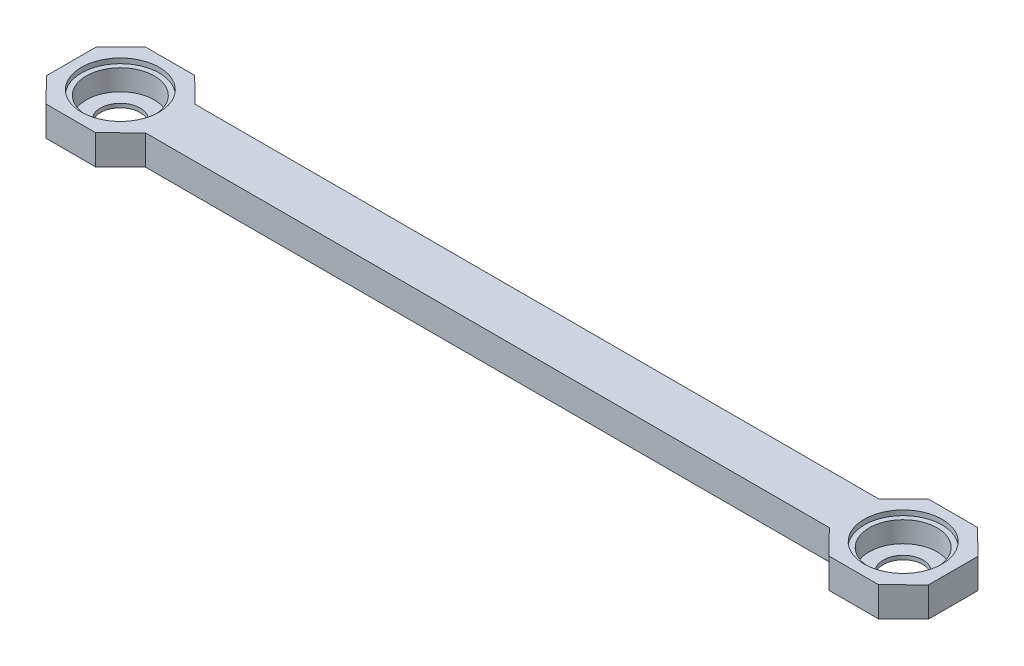
ISO-10303-21;
HEADER;
FILE_DESCRIPTION(('STEP AP214'),'2;1');
FILE_NAME('part.step','',(''),(''),'','','');
FILE_SCHEMA(('AUTOMOTIVE_DESIGN { 1 0 10303 214 1 1 1 1 }'));
ENDSEC;
DATA;
#1=APPLICATION_CONTEXT('core data for automotive mechanical design processes');
#2=APPLICATION_PROTOCOL_DEFINITION('international standard','automotive_design',2000,#1);
#3=PRODUCT_CONTEXT('',#1,'mechanical');
#4=PRODUCT('Part','Part','',(#3));
#5=PRODUCT_RELATED_PRODUCT_CATEGORY('part','',(#4));
#6=PRODUCT_DEFINITION_FORMATION('','',#4);
#7=PRODUCT_DEFINITION_CONTEXT('part definition',#1,'design');
#8=PRODUCT_DEFINITION('design','',#6,#7);
#9=PRODUCT_DEFINITION_SHAPE('','',#8);
#10=(LENGTH_UNIT() NAMED_UNIT(*) SI_UNIT(.MILLI.,.METRE.));
#11=(NAMED_UNIT(*) PLANE_ANGLE_UNIT() SI_UNIT($,.RADIAN.));
#12=(NAMED_UNIT(*) SI_UNIT($,.STERADIAN.) SOLID_ANGLE_UNIT());
#13=UNCERTAINTY_MEASURE_WITH_UNIT(LENGTH_MEASURE(1.E-05),#10,'distance_accuracy_value','');
#14=(GEOMETRIC_REPRESENTATION_CONTEXT(3) GLOBAL_UNCERTAINTY_ASSIGNED_CONTEXT((#13)) GLOBAL_UNIT_ASSIGNED_CONTEXT((#10,
#11,#12)) REPRESENTATION_CONTEXT('',''));
#15=CARTESIAN_POINT('',(0.,0.,0.));
#16=DIRECTION('',(0.,0.,1.));
#17=DIRECTION('',(1.,0.,0.));
#18=AXIS2_PLACEMENT_3D('',#15,#16,#17);
#19=CARTESIAN_POINT('',(82.6366555158427,0.8,0.));
#20=DIRECTION('',(0.,1.,0.));
#21=DIRECTION('',(0.,0.,1.));
#22=AXIS2_PLACEMENT_3D('',#19,#20,#21);
#23=CYLINDRICAL_SURFACE('',#22,6.85000000000001);
#24=CARTESIAN_POINT('',(82.6366555158427,0.8,0.));
#25=DIRECTION('',(0.,1.,0.));
#26=DIRECTION('',(0.,0.,1.));
#27=AXIS2_PLACEMENT_3D('',#24,#25,#26);
#28=CIRCLE('',#27,6.85000000000001);
#29=CARTESIAN_POINT('',(82.6366555158427,0.8,6.85000000000001));
#30=VERTEX_POINT('',#29);
#31=EDGE_CURVE('E252',#30,#30,#28,.T.);
#32=ORIENTED_EDGE('',*,*,#31,.F.);
#33=EDGE_LOOP('',(#32));
#34=FACE_BOUND('',#33,.T.);
#35=CARTESIAN_POINT('',(82.6366555158427,5.,0.));
#36=DIRECTION('',(0.,1.,0.));
#37=DIRECTION('',(0.,0.,1.));
#38=AXIS2_PLACEMENT_3D('',#35,#36,#37);
#39=CIRCLE('',#38,6.85000000000001);
#40=CARTESIAN_POINT('',(82.6366555158427,5.,6.85000000000001));
#41=VERTEX_POINT('',#40);
#42=EDGE_CURVE('E38',#41,#41,#39,.F.);
#43=ORIENTED_EDGE('',*,*,#42,.F.);
#44=EDGE_LOOP('',(#43));
#45=FACE_BOUND('',#44,.T.);
#46=ADVANCED_FACE('F34',(#34,#45),#23,.F.);
#47=CARTESIAN_POINT('',(-75.3633444841573,0.8,0.));
#48=DIRECTION('',(0.,1.,0.));
#49=DIRECTION('',(0.,0.,1.));
#50=AXIS2_PLACEMENT_3D('',#47,#48,#49);
#51=CYLINDRICAL_SURFACE('',#50,6.85);
#52=CARTESIAN_POINT('',(-75.3633444841573,0.8,0.));
#53=DIRECTION('',(0.,1.,0.));
#54=DIRECTION('',(0.,0.,1.));
#55=AXIS2_PLACEMENT_3D('',#52,#53,#54);
#56=CIRCLE('',#55,6.85);
#57=CARTESIAN_POINT('',(-75.3633444841573,0.8,6.85));
#58=VERTEX_POINT('',#57);
#59=EDGE_CURVE('E261',#58,#58,#56,.T.);
#60=ORIENTED_EDGE('',*,*,#59,.F.);
#61=EDGE_LOOP('',(#60));
#62=FACE_BOUND('',#61,.T.);
#63=CARTESIAN_POINT('',(-75.3633444841573,5.,0.));
#64=DIRECTION('',(0.,1.,0.));
#65=DIRECTION('',(0.,0.,1.));
#66=AXIS2_PLACEMENT_3D('',#63,#64,#65);
#67=CIRCLE('',#66,6.85);
#68=CARTESIAN_POINT('',(-75.3633444841573,5.,6.85));
#69=VERTEX_POINT('',#68);
#70=EDGE_CURVE('E255',#69,#69,#67,.F.);
#71=ORIENTED_EDGE('',*,*,#70,.F.);
#72=EDGE_LOOP('',(#71));
#73=FACE_BOUND('',#72,.T.);
#74=ADVANCED_FACE('F337',(#62,#73),#51,.F.);
#75=CARTESIAN_POINT('',(-75.3633444841573,6.,0.));
#76=DIRECTION('',(0.,-1.,0.));
#77=DIRECTION('',(0.,0.,-1.));
#78=AXIS2_PLACEMENT_3D('',#75,#76,#77);
#79=CYLINDRICAL_SURFACE('',#78,4.00000000000001);
#80=CARTESIAN_POINT('',(-75.3633444841573,0.,0.));
#81=DIRECTION('',(0.,1.,0.));
#82=DIRECTION('',(0.,0.,1.));
#83=AXIS2_PLACEMENT_3D('',#80,#81,#82);
#84=CIRCLE('',#83,4.00000000000001);
#85=CARTESIAN_POINT('',(-75.3633444841573,0.,4.00000000000001));
#86=VERTEX_POINT('',#85);
#87=EDGE_CURVE('E185',#86,#86,#84,.T.);
#88=ORIENTED_EDGE('',*,*,#87,.F.);
#89=EDGE_LOOP('',(#88));
#90=FACE_BOUND('',#89,.T.);
#91=CARTESIAN_POINT('',(-75.3633444841573,0.8,0.));
#92=DIRECTION('',(0.,1.,0.));
#93=DIRECTION('',(0.,0.,1.));
#94=AXIS2_PLACEMENT_3D('',#91,#92,#93);
#95=CIRCLE('',#94,4.00000000000001);
#96=CARTESIAN_POINT('',(-75.3633444841573,0.8,4.00000000000001));
#97=VERTEX_POINT('',#96);
#98=EDGE_CURVE('E251',#97,#97,#95,.T.);
#99=ORIENTED_EDGE('',*,*,#98,.T.);
#100=EDGE_LOOP('',(#99));
#101=FACE_BOUND('',#100,.T.);
#102=ADVANCED_FACE('F343',(#90,#101),#79,.F.);
#103=CARTESIAN_POINT('',(82.6366555158427,6.,0.));
#104=DIRECTION('',(0.,-1.,0.));
#105=DIRECTION('',(0.,0.,-1.));
#106=AXIS2_PLACEMENT_3D('',#103,#104,#105);
#107=CYLINDRICAL_SURFACE('',#106,4.00000000000001);
#108=CARTESIAN_POINT('',(82.6366555158427,0.,0.));
#109=DIRECTION('',(0.,1.,0.));
#110=DIRECTION('',(0.,0.,1.));
#111=AXIS2_PLACEMENT_3D('',#108,#109,#110);
#112=CIRCLE('',#111,4.00000000000001);
#113=CARTESIAN_POINT('',(82.6366555158427,0.,4.00000000000001));
#114=VERTEX_POINT('',#113);
#115=EDGE_CURVE('E254',#114,#114,#112,.T.);
#116=ORIENTED_EDGE('',*,*,#115,.F.);
#117=EDGE_LOOP('',(#116));
#118=FACE_BOUND('',#117,.T.);
#119=CARTESIAN_POINT('',(82.6366555158427,0.8,0.));
#120=DIRECTION('',(0.,1.,0.));
#121=DIRECTION('',(0.,0.,1.));
#122=AXIS2_PLACEMENT_3D('',#119,#120,#121);
#123=CIRCLE('',#122,4.00000000000001);
#124=CARTESIAN_POINT('',(82.6366555158427,0.8,4.00000000000001));
#125=VERTEX_POINT('',#124);
#126=EDGE_CURVE('E248',#125,#125,#123,.T.);
#127=ORIENTED_EDGE('',*,*,#126,.T.);
#128=EDGE_LOOP('',(#127));
#129=FACE_BOUND('',#128,.T.);
#130=ADVANCED_FACE('F354',(#118,#129),#107,.F.);
#131=CARTESIAN_POINT('',(0.,6.,0.));
#132=DIRECTION('',(0.,-1.,0.));
#133=DIRECTION('',(0.,0.,-1.));
#134=AXIS2_PLACEMENT_3D('',#131,#132,#133);
#135=PLANE('',#134);
#136=CARTESIAN_POINT('',(82.6366555158427,6.,0.));
#137=DIRECTION('',(0.,1.,0.));
#138=DIRECTION('',(0.,0.,1.));
#139=AXIS2_PLACEMENT_3D('',#136,#137,#138);
#140=CIRCLE('',#139,7.84999999999998);
#141=CARTESIAN_POINT('',(82.6366555158427,6.,7.84999999999998));
#142=VERTEX_POINT('',#141);
#143=EDGE_CURVE('E263',#142,#142,#140,.T.);
#144=ORIENTED_EDGE('',*,*,#143,.F.);
#145=EDGE_LOOP('',(#144));
#146=FACE_BOUND('',#145,.T.);
#147=CARTESIAN_POINT('',(-75.3633444841573,6.,0.));
#148=DIRECTION('',(0.,1.,0.));
#149=DIRECTION('',(0.,0.,1.));
#150=AXIS2_PLACEMENT_3D('',#147,#148,#149);
#151=CIRCLE('',#150,7.84999999999999);
#152=CARTESIAN_POINT('',(-75.3633444841573,6.,7.84999999999999));
#153=VERTEX_POINT('',#152);
#154=EDGE_CURVE('E273',#153,#153,#151,.T.);
#155=ORIENTED_EDGE('',*,*,#154,.F.);
#156=EDGE_LOOP('',(#155));
#157=FACE_BOUND('',#156,.T.);
#158=DIRECTION('',(-1.,0.,0.));
#159=VECTOR('',#158,1.);
#160=CARTESIAN_POINT('',(-65.2623239697237,6.,-5.));
#161=LINE('',#160,#159);
#162=CARTESIAN_POINT('',(72.7376760302763,6.,-5.));
#163=VERTEX_POINT('',#162);
#164=CARTESIAN_POINT('',(-65.2623239697237,6.,-5.));
#165=VERTEX_POINT('',#164);
#166=EDGE_CURVE('E212',#163,#165,#161,.T.);
#167=ORIENTED_EDGE('',*,*,#166,.T.);
#168=DIRECTION('',(-0.714142857145833,0.,-0.699999985419705));
#169=VECTOR('',#168,1.);
#170=CARTESIAN_POINT('',(-65.2623239697237,6.,-5.));
#171=LINE('',#170,#169);
#172=CARTESIAN_POINT('',(-70.3633444841573,6.,-10.));
#173=VERTEX_POINT('',#172);
#174=EDGE_CURVE('E120',#165,#173,#171,.T.);
#175=ORIENTED_EDGE('',*,*,#174,.T.);
#176=DIRECTION('',(-1.,0.,0.));
#177=VECTOR('',#176,1.);
#178=CARTESIAN_POINT('',(-70.3633444841573,6.,-10.));
#179=LINE('',#178,#177);
#180=CARTESIAN_POINT('',(-80.3633444841573,6.,-10.));
#181=VERTEX_POINT('',#180);
#182=EDGE_CURVE('E286',#173,#181,#179,.T.);
#183=ORIENTED_EDGE('',*,*,#182,.T.);
#184=DIRECTION('',(-0.699854212223766,0.,0.714285714285714));
#185=VECTOR('',#184,1.);
#186=CARTESIAN_POINT('',(-80.3633444841573,6.,-10.));
#187=LINE('',#186,#185);
#188=CARTESIAN_POINT('',(-85.2623239697237,6.,-5.));
#189=VERTEX_POINT('',#188);
#190=EDGE_CURVE('E288',#181,#189,#187,.T.);
#191=ORIENTED_EDGE('',*,*,#190,.T.);
#192=DIRECTION('',(0.,0.,1.));
#193=VECTOR('',#192,1.);
#194=CARTESIAN_POINT('',(-85.2623239697237,6.,-5.));
#195=LINE('',#194,#193);
#196=CARTESIAN_POINT('',(-85.2623239697237,6.,5.));
#197=VERTEX_POINT('',#196);
#198=EDGE_CURVE('E290',#189,#197,#195,.T.);
#199=ORIENTED_EDGE('',*,*,#198,.T.);
#200=DIRECTION('',(0.699854212223765,0.,0.714285714285715));
#201=VECTOR('',#200,1.);
#202=CARTESIAN_POINT('',(-80.3633444841573,6.,10.));
#203=LINE('',#202,#201);
#204=CARTESIAN_POINT('',(-80.3633444841573,6.,10.));
#205=VERTEX_POINT('',#204);
#206=EDGE_CURVE('E292',#197,#205,#203,.T.);
#207=ORIENTED_EDGE('',*,*,#206,.T.);
#208=DIRECTION('',(1.,0.,0.));
#209=VECTOR('',#208,1.);
#210=CARTESIAN_POINT('',(-70.3633444841573,6.,10.));
#211=LINE('',#210,#209);
#212=CARTESIAN_POINT('',(-70.3633444841573,6.,10.));
#213=VERTEX_POINT('',#212);
#214=EDGE_CURVE('E294',#205,#213,#211,.T.);
#215=ORIENTED_EDGE('',*,*,#214,.T.);
#216=DIRECTION('',(0.714142857145833,0.,-0.699999985419705));
#217=VECTOR('',#216,1.);
#218=CARTESIAN_POINT('',(-65.2623239697237,6.,5.));
#219=LINE('',#218,#217);
#220=CARTESIAN_POINT('',(-65.2623239697237,6.,5.));
#221=VERTEX_POINT('',#220);
#222=EDGE_CURVE('E296',#213,#221,#219,.T.);
#223=ORIENTED_EDGE('',*,*,#222,.T.);
#224=DIRECTION('',(1.,0.,0.));
#225=VECTOR('',#224,1.);
#226=CARTESIAN_POINT('',(72.7376760302763,6.,5.));
#227=LINE('',#226,#225);
#228=CARTESIAN_POINT('',(72.7376760302763,6.,5.));
#229=VERTEX_POINT('',#228);
#230=EDGE_CURVE('E298',#221,#229,#227,.T.);
#231=ORIENTED_EDGE('',*,*,#230,.T.);
#232=DIRECTION('',(0.699854212223766,0.,0.714285714285714));
#233=VECTOR('',#232,1.);
#234=CARTESIAN_POINT('',(72.7376760302763,6.,5.));
#235=LINE('',#234,#233);
#236=CARTESIAN_POINT('',(77.6366555158427,6.,10.));
#237=VERTEX_POINT('',#236);
#238=EDGE_CURVE('E300',#229,#237,#235,.T.);
#239=ORIENTED_EDGE('',*,*,#238,.T.);
#240=DIRECTION('',(1.,0.,0.));
#241=VECTOR('',#240,1.);
#242=CARTESIAN_POINT('',(77.6366555158427,6.,10.));
#243=LINE('',#242,#241);
#244=CARTESIAN_POINT('',(87.6366555158427,6.,10.));
#245=VERTEX_POINT('',#244);
#246=EDGE_CURVE('E302',#237,#245,#243,.T.);
#247=ORIENTED_EDGE('',*,*,#246,.T.);
#248=DIRECTION('',(0.714285714285714,0.,-0.699854212223765));
#249=VECTOR('',#248,1.);
#250=CARTESIAN_POINT('',(87.6366555158427,6.,10.));
#251=LINE('',#250,#249);
#252=CARTESIAN_POINT('',(92.739759146641,6.,5.));
#253=VERTEX_POINT('',#252);
#254=EDGE_CURVE('E304',#245,#253,#251,.T.);
#255=ORIENTED_EDGE('',*,*,#254,.T.);
#256=DIRECTION('',(0.,0.,-1.));
#257=VECTOR('',#256,1.);
#258=CARTESIAN_POINT('',(92.739759146641,6.,-5.));
#259=LINE('',#258,#257);
#260=CARTESIAN_POINT('',(92.739759146641,6.,-5.));
#261=VERTEX_POINT('',#260);
#262=EDGE_CURVE('E163',#253,#261,#259,.T.);
#263=ORIENTED_EDGE('',*,*,#262,.T.);
#264=DIRECTION('',(-0.714285714285714,0.,-0.699854212223765));
#265=VECTOR('',#264,1.);
#266=CARTESIAN_POINT('',(87.6366555158427,6.,-10.));
#267=LINE('',#266,#265);
#268=CARTESIAN_POINT('',(87.6366555158427,6.,-10.));
#269=VERTEX_POINT('',#268);
#270=EDGE_CURVE('E157',#261,#269,#267,.T.);
#271=ORIENTED_EDGE('',*,*,#270,.T.);
#272=DIRECTION('',(-1.,0.,0.));
#273=VECTOR('',#272,1.);
#274=CARTESIAN_POINT('',(77.6366555158427,6.,-10.));
#275=LINE('',#274,#273);
#276=CARTESIAN_POINT('',(77.6366555158427,6.,-10.));
#277=VERTEX_POINT('',#276);
#278=EDGE_CURVE('E161',#269,#277,#275,.T.);
#279=ORIENTED_EDGE('',*,*,#278,.T.);
#280=DIRECTION('',(-0.699854212223766,0.,0.714285714285714));
#281=VECTOR('',#280,1.);
#282=CARTESIAN_POINT('',(72.7376760302763,6.,-5.));
#283=LINE('',#282,#281);
#284=EDGE_CURVE('E53',#277,#163,#283,.T.);
#285=ORIENTED_EDGE('',*,*,#284,.T.);
#286=EDGE_LOOP('',(#167,#175,#183,#191,#199,#207,#215,#223,#231,#239,#247,#255,#263,#271,#279,#285));
#287=FACE_BOUND('',#286,.T.);
#288=ADVANCED_FACE('F159',(#146,#157,#287),#135,.F.);
#289=CARTESIAN_POINT('',(0.,0.,0.));
#290=DIRECTION('',(0.,-1.,0.));
#291=DIRECTION('',(0.,0.,-1.));
#292=AXIS2_PLACEMENT_3D('',#289,#290,#291);
#293=PLANE('',#292);
#294=ORIENTED_EDGE('',*,*,#87,.T.);
#295=EDGE_LOOP('',(#294));
#296=FACE_BOUND('',#295,.T.);
#297=DIRECTION('',(-1.,0.,0.));
#298=VECTOR('',#297,1.);
#299=CARTESIAN_POINT('',(-65.2623239697237,0.,-5.));
#300=LINE('',#299,#298);
#301=CARTESIAN_POINT('',(72.7376760302763,0.,-5.));
#302=VERTEX_POINT('',#301);
#303=CARTESIAN_POINT('',(-65.2623239697237,0.,-5.));
#304=VERTEX_POINT('',#303);
#305=EDGE_CURVE('E181',#302,#304,#300,.T.);
#306=ORIENTED_EDGE('',*,*,#305,.F.);
#307=DIRECTION('',(-0.699854212223766,0.,0.714285714285714));
#308=VECTOR('',#307,1.);
#309=CARTESIAN_POINT('',(72.7376760302763,0.,-5.));
#310=LINE('',#309,#308);
#311=CARTESIAN_POINT('',(77.6366555158427,0.,-10.));
#312=VERTEX_POINT('',#311);
#313=EDGE_CURVE('E112',#312,#302,#310,.T.);
#314=ORIENTED_EDGE('',*,*,#313,.F.);
#315=DIRECTION('',(-1.,0.,0.));
#316=VECTOR('',#315,1.);
#317=CARTESIAN_POINT('',(77.6366555158427,0.,-10.));
#318=LINE('',#317,#316);
#319=CARTESIAN_POINT('',(87.6366555158427,0.,-10.));
#320=VERTEX_POINT('',#319);
#321=EDGE_CURVE('E106',#320,#312,#318,.T.);
#322=ORIENTED_EDGE('',*,*,#321,.F.);
#323=DIRECTION('',(-0.714285714285714,0.,-0.699854212223765));
#324=VECTOR('',#323,1.);
#325=CARTESIAN_POINT('',(87.6366555158427,0.,-10.));
#326=LINE('',#325,#324);
#327=CARTESIAN_POINT('',(92.739759146641,0.,-5.));
#328=VERTEX_POINT('',#327);
#329=EDGE_CURVE('E171',#328,#320,#326,.T.);
#330=ORIENTED_EDGE('',*,*,#329,.F.);
#331=DIRECTION('',(0.,0.,-1.));
#332=VECTOR('',#331,1.);
#333=CARTESIAN_POINT('',(92.739759146641,0.,-5.));
#334=LINE('',#333,#332);
#335=CARTESIAN_POINT('',(92.739759146641,0.,5.));
#336=VERTEX_POINT('',#335);
#337=EDGE_CURVE('E207',#336,#328,#334,.T.);
#338=ORIENTED_EDGE('',*,*,#337,.F.);
#339=DIRECTION('',(0.714285714285714,0.,-0.699854212223765));
#340=VECTOR('',#339,1.);
#341=CARTESIAN_POINT('',(87.6366555158427,0.,10.));
#342=LINE('',#341,#340);
#343=CARTESIAN_POINT('',(87.6366555158427,0.,10.));
#344=VERTEX_POINT('',#343);
#345=EDGE_CURVE('E205',#344,#336,#342,.T.);
#346=ORIENTED_EDGE('',*,*,#345,.F.);
#347=DIRECTION('',(1.,0.,0.));
#348=VECTOR('',#347,1.);
#349=CARTESIAN_POINT('',(77.6366555158427,0.,10.));
#350=LINE('',#349,#348);
#351=CARTESIAN_POINT('',(77.6366555158427,0.,10.));
#352=VERTEX_POINT('',#351);
#353=EDGE_CURVE('E203',#352,#344,#350,.T.);
#354=ORIENTED_EDGE('',*,*,#353,.F.);
#355=DIRECTION('',(0.699854212223766,0.,0.714285714285714));
#356=VECTOR('',#355,1.);
#357=CARTESIAN_POINT('',(72.7376760302763,0.,5.));
#358=LINE('',#357,#356);
#359=CARTESIAN_POINT('',(72.7376760302763,0.,5.));
#360=VERTEX_POINT('',#359);
#361=EDGE_CURVE('E201',#360,#352,#358,.T.);
#362=ORIENTED_EDGE('',*,*,#361,.F.);
#363=DIRECTION('',(1.,0.,0.));
#364=VECTOR('',#363,1.);
#365=CARTESIAN_POINT('',(72.7376760302763,0.,5.));
#366=LINE('',#365,#364);
#367=CARTESIAN_POINT('',(-65.2623239697237,0.,5.));
#368=VERTEX_POINT('',#367);
#369=EDGE_CURVE('E199',#368,#360,#366,.T.);
#370=ORIENTED_EDGE('',*,*,#369,.F.);
#371=DIRECTION('',(0.714142857145833,0.,-0.699999985419705));
#372=VECTOR('',#371,1.);
#373=CARTESIAN_POINT('',(-65.2623239697237,0.,5.));
#374=LINE('',#373,#372);
#375=CARTESIAN_POINT('',(-70.3633444841573,0.,10.));
#376=VERTEX_POINT('',#375);
#377=EDGE_CURVE('E197',#376,#368,#374,.T.);
#378=ORIENTED_EDGE('',*,*,#377,.F.);
#379=DIRECTION('',(1.,0.,0.));
#380=VECTOR('',#379,1.);
#381=CARTESIAN_POINT('',(-70.3633444841573,0.,10.));
#382=LINE('',#381,#380);
#383=CARTESIAN_POINT('',(-80.3633444841573,0.,10.));
#384=VERTEX_POINT('',#383);
#385=EDGE_CURVE('E195',#384,#376,#382,.T.);
#386=ORIENTED_EDGE('',*,*,#385,.F.);
#387=DIRECTION('',(0.699854212223765,0.,0.714285714285715));
#388=VECTOR('',#387,1.);
#389=CARTESIAN_POINT('',(-80.3633444841573,0.,10.));
#390=LINE('',#389,#388);
#391=CARTESIAN_POINT('',(-85.2623239697237,0.,5.));
#392=VERTEX_POINT('',#391);
#393=EDGE_CURVE('E193',#392,#384,#390,.T.);
#394=ORIENTED_EDGE('',*,*,#393,.F.);
#395=DIRECTION('',(0.,0.,1.));
#396=VECTOR('',#395,1.);
#397=CARTESIAN_POINT('',(-85.2623239697237,0.,-5.));
#398=LINE('',#397,#396);
#399=CARTESIAN_POINT('',(-85.2623239697237,0.,-5.));
#400=VERTEX_POINT('',#399);
#401=EDGE_CURVE('E191',#400,#392,#398,.T.);
#402=ORIENTED_EDGE('',*,*,#401,.F.);
#403=DIRECTION('',(-0.699854212223766,0.,0.714285714285714));
#404=VECTOR('',#403,1.);
#405=CARTESIAN_POINT('',(-80.3633444841573,0.,-10.));
#406=LINE('',#405,#404);
#407=CARTESIAN_POINT('',(-80.3633444841573,0.,-10.));
#408=VERTEX_POINT('',#407);
#409=EDGE_CURVE('E189',#408,#400,#406,.T.);
#410=ORIENTED_EDGE('',*,*,#409,.F.);
#411=DIRECTION('',(-1.,0.,0.));
#412=VECTOR('',#411,1.);
#413=CARTESIAN_POINT('',(-70.3633444841573,0.,-10.));
#414=LINE('',#413,#412);
#415=CARTESIAN_POINT('',(-70.3633444841573,0.,-10.));
#416=VERTEX_POINT('',#415);
#417=EDGE_CURVE('E187',#416,#408,#414,.T.);
#418=ORIENTED_EDGE('',*,*,#417,.F.);
#419=DIRECTION('',(-0.714142857145833,0.,-0.699999985419705));
#420=VECTOR('',#419,1.);
#421=CARTESIAN_POINT('',(-65.2623239697237,0.,-5.));
#422=LINE('',#421,#420);
#423=EDGE_CURVE('E184',#304,#416,#422,.T.);
#424=ORIENTED_EDGE('',*,*,#423,.F.);
#425=EDGE_LOOP('',(#306,#314,#322,#330,#338,#346,#354,#362,#370,#378,#386,#394,#402,#410,#418,#424));
#426=FACE_BOUND('',#425,.T.);
#427=ORIENTED_EDGE('',*,*,#115,.T.);
#428=EDGE_LOOP('',(#427));
#429=FACE_BOUND('',#428,.T.);
#430=ADVANCED_FACE('F317',(#296,#426,#429),#293,.T.);
#431=CARTESIAN_POINT('',(-65.2623239697237,6.,-5.));
#432=DIRECTION('',(0.,0.,1.));
#433=DIRECTION('',(1.,0.,0.));
#434=AXIS2_PLACEMENT_3D('',#431,#432,#433);
#435=PLANE('',#434);
#436=ORIENTED_EDGE('',*,*,#305,.T.);
#437=DIRECTION('',(0.,-1.,0.));
#438=VECTOR('',#437,1.);
#439=CARTESIAN_POINT('',(-65.2623239697237,6.,-5.));
#440=LINE('',#439,#438);
#441=EDGE_CURVE('E11',#165,#304,#440,.T.);
#442=ORIENTED_EDGE('',*,*,#441,.F.);
#443=ORIENTED_EDGE('',*,*,#166,.F.);
#444=DIRECTION('',(0.,-1.,0.));
#445=VECTOR('',#444,1.);
#446=CARTESIAN_POINT('',(72.7376760302763,6.,-5.));
#447=LINE('',#446,#445);
#448=EDGE_CURVE('E177',#163,#302,#447,.T.);
#449=ORIENTED_EDGE('',*,*,#448,.T.);
#450=EDGE_LOOP('',(#436,#442,#443,#449));
#451=FACE_BOUND('',#450,.T.);
#452=ADVANCED_FACE('F36',(#451),#435,.F.);
#453=CARTESIAN_POINT('',(-65.2623239697237,6.,-5.));
#454=DIRECTION('',(-0.699999985419705,0.,0.714142857145833));
#455=DIRECTION('',(0.714142857145833,0.,0.699999985419705));
#456=AXIS2_PLACEMENT_3D('',#453,#454,#455);
#457=PLANE('',#456);
#458=ORIENTED_EDGE('',*,*,#423,.T.);
#459=DIRECTION('',(0.,-1.,0.));
#460=VECTOR('',#459,1.);
#461=CARTESIAN_POINT('',(-70.3633444841573,6.,-10.));
#462=LINE('',#461,#460);
#463=EDGE_CURVE('E44',#173,#416,#462,.T.);
#464=ORIENTED_EDGE('',*,*,#463,.F.);
#465=ORIENTED_EDGE('',*,*,#174,.F.);
#466=ORIENTED_EDGE('',*,*,#441,.T.);
#467=EDGE_LOOP('',(#458,#464,#465,#466));
#468=FACE_BOUND('',#467,.T.);
#469=ADVANCED_FACE('F368',(#468),#457,.F.);
#470=CARTESIAN_POINT('',(-70.3633444841573,6.,-10.));
#471=DIRECTION('',(0.,0.,1.));
#472=DIRECTION('',(1.,0.,0.));
#473=AXIS2_PLACEMENT_3D('',#470,#471,#472);
#474=PLANE('',#473);
#475=ORIENTED_EDGE('',*,*,#417,.T.);
#476=DIRECTION('',(0.,-1.,0.));
#477=VECTOR('',#476,1.);
#478=CARTESIAN_POINT('',(-80.3633444841573,6.,-10.));
#479=LINE('',#478,#477);
#480=EDGE_CURVE('E243',#181,#408,#479,.T.);
#481=ORIENTED_EDGE('',*,*,#480,.F.);
#482=ORIENTED_EDGE('',*,*,#182,.F.);
#483=ORIENTED_EDGE('',*,*,#463,.T.);
#484=EDGE_LOOP('',(#475,#481,#482,#483));
#485=FACE_BOUND('',#484,.T.);
#486=ADVANCED_FACE('F378',(#485),#474,.F.);
#487=CARTESIAN_POINT('',(-80.3633444841573,6.,-10.));
#488=DIRECTION('',(0.714285714285714,0.,0.699854212223766));
#489=DIRECTION('',(0.699854212223766,0.,-0.714285714285714));
#490=AXIS2_PLACEMENT_3D('',#487,#488,#489);
#491=PLANE('',#490);
#492=ORIENTED_EDGE('',*,*,#409,.T.);
#493=DIRECTION('',(0.,-1.,0.));
#494=VECTOR('',#493,1.);
#495=CARTESIAN_POINT('',(-85.2623239697237,6.,-5.));
#496=LINE('',#495,#494);
#497=EDGE_CURVE('E240',#189,#400,#496,.T.);
#498=ORIENTED_EDGE('',*,*,#497,.F.);
#499=ORIENTED_EDGE('',*,*,#190,.F.);
#500=ORIENTED_EDGE('',*,*,#480,.T.);
#501=EDGE_LOOP('',(#492,#498,#499,#500));
#502=FACE_BOUND('',#501,.T.);
#503=ADVANCED_FACE('F382',(#502),#491,.F.);
#504=CARTESIAN_POINT('',(-85.2623239697237,6.,-5.));
#505=DIRECTION('',(1.,0.,0.));
#506=DIRECTION('',(0.,0.,-1.));
#507=AXIS2_PLACEMENT_3D('',#504,#505,#506);
#508=PLANE('',#507);
#509=ORIENTED_EDGE('',*,*,#401,.T.);
#510=DIRECTION('',(0.,-1.,0.));
#511=VECTOR('',#510,1.);
#512=CARTESIAN_POINT('',(-85.2623239697237,6.,5.));
#513=LINE('',#512,#511);
#514=EDGE_CURVE('E237',#197,#392,#513,.T.);
#515=ORIENTED_EDGE('',*,*,#514,.F.);
#516=ORIENTED_EDGE('',*,*,#198,.F.);
#517=ORIENTED_EDGE('',*,*,#497,.T.);
#518=EDGE_LOOP('',(#509,#515,#516,#517));
#519=FACE_BOUND('',#518,.T.);
#520=ADVANCED_FACE('F388',(#519),#508,.F.);
#521=CARTESIAN_POINT('',(-80.3633444841573,6.,10.));
#522=DIRECTION('',(0.714285714285715,0.,-0.699854212223764));
#523=DIRECTION('',(-0.699854212223764,0.,-0.714285714285715));
#524=AXIS2_PLACEMENT_3D('',#521,#522,#523);
#525=PLANE('',#524);
#526=ORIENTED_EDGE('',*,*,#393,.T.);
#527=DIRECTION('',(0.,-1.,0.));
#528=VECTOR('',#527,1.);
#529=CARTESIAN_POINT('',(-80.3633444841573,6.,10.));
#530=LINE('',#529,#528);
#531=EDGE_CURVE('E234',#205,#384,#530,.T.);
#532=ORIENTED_EDGE('',*,*,#531,.F.);
#533=ORIENTED_EDGE('',*,*,#206,.F.);
#534=ORIENTED_EDGE('',*,*,#514,.T.);
#535=EDGE_LOOP('',(#526,#532,#533,#534));
#536=FACE_BOUND('',#535,.T.);
#537=ADVANCED_FACE('F392',(#536),#525,.F.);
#538=CARTESIAN_POINT('',(-70.3633444841573,6.,10.));
#539=DIRECTION('',(0.,0.,-1.));
#540=DIRECTION('',(-1.,0.,0.));
#541=AXIS2_PLACEMENT_3D('',#538,#539,#540);
#542=PLANE('',#541);
#543=ORIENTED_EDGE('',*,*,#385,.T.);
#544=DIRECTION('',(0.,-1.,0.));
#545=VECTOR('',#544,1.);
#546=CARTESIAN_POINT('',(-70.3633444841573,6.,10.));
#547=LINE('',#546,#545);
#548=EDGE_CURVE('E231',#213,#376,#547,.T.);
#549=ORIENTED_EDGE('',*,*,#548,.F.);
#550=ORIENTED_EDGE('',*,*,#214,.F.);
#551=ORIENTED_EDGE('',*,*,#531,.T.);
#552=EDGE_LOOP('',(#543,#549,#550,#551));
#553=FACE_BOUND('',#552,.T.);
#554=ADVANCED_FACE('F396',(#553),#542,.F.);
#555=CARTESIAN_POINT('',(-65.2623239697237,6.,5.));
#556=DIRECTION('',(-0.699999985419705,0.,-0.714142857145833));
#557=DIRECTION('',(-0.714142857145833,0.,0.699999985419705));
#558=AXIS2_PLACEMENT_3D('',#555,#556,#557);
#559=PLANE('',#558);
#560=ORIENTED_EDGE('',*,*,#377,.T.);
#561=DIRECTION('',(0.,-1.,0.));
#562=VECTOR('',#561,1.);
#563=CARTESIAN_POINT('',(-65.2623239697237,6.,5.));
#564=LINE('',#563,#562);
#565=EDGE_CURVE('E228',#221,#368,#564,.T.);
#566=ORIENTED_EDGE('',*,*,#565,.F.);
#567=ORIENTED_EDGE('',*,*,#222,.F.);
#568=ORIENTED_EDGE('',*,*,#548,.T.);
#569=EDGE_LOOP('',(#560,#566,#567,#568));
#570=FACE_BOUND('',#569,.T.);
#571=ADVANCED_FACE('F400',(#570),#559,.F.);
#572=CARTESIAN_POINT('',(72.7376760302763,6.,5.));
#573=DIRECTION('',(0.,0.,-1.));
#574=DIRECTION('',(-1.,0.,0.));
#575=AXIS2_PLACEMENT_3D('',#572,#573,#574);
#576=PLANE('',#575);
#577=ORIENTED_EDGE('',*,*,#369,.T.);
#578=DIRECTION('',(0.,-1.,0.));
#579=VECTOR('',#578,1.);
#580=CARTESIAN_POINT('',(72.7376760302763,6.,5.));
#581=LINE('',#580,#579);
#582=EDGE_CURVE('E225',#229,#360,#581,.T.);
#583=ORIENTED_EDGE('',*,*,#582,.F.);
#584=ORIENTED_EDGE('',*,*,#230,.F.);
#585=ORIENTED_EDGE('',*,*,#565,.T.);
#586=EDGE_LOOP('',(#577,#583,#584,#585));
#587=FACE_BOUND('',#586,.T.);
#588=ADVANCED_FACE('F404',(#587),#576,.F.);
#589=CARTESIAN_POINT('',(72.7376760302763,6.,5.));
#590=DIRECTION('',(0.714285714285714,0.,-0.699854212223766));
#591=DIRECTION('',(-0.699854212223766,0.,-0.714285714285714));
#592=AXIS2_PLACEMENT_3D('',#589,#590,#591);
#593=PLANE('',#592);
#594=ORIENTED_EDGE('',*,*,#361,.T.);
#595=DIRECTION('',(0.,-1.,0.));
#596=VECTOR('',#595,1.);
#597=CARTESIAN_POINT('',(77.6366555158427,6.,10.));
#598=LINE('',#597,#596);
#599=EDGE_CURVE('E222',#237,#352,#598,.T.);
#600=ORIENTED_EDGE('',*,*,#599,.F.);
#601=ORIENTED_EDGE('',*,*,#238,.F.);
#602=ORIENTED_EDGE('',*,*,#582,.T.);
#603=EDGE_LOOP('',(#594,#600,#601,#602));
#604=FACE_BOUND('',#603,.T.);
#605=ADVANCED_FACE('F408',(#604),#593,.F.);
#606=CARTESIAN_POINT('',(77.6366555158427,6.,10.));
#607=DIRECTION('',(0.,0.,-1.));
#608=DIRECTION('',(-1.,0.,0.));
#609=AXIS2_PLACEMENT_3D('',#606,#607,#608);
#610=PLANE('',#609);
#611=ORIENTED_EDGE('',*,*,#353,.T.);
#612=DIRECTION('',(0.,-1.,0.));
#613=VECTOR('',#612,1.);
#614=CARTESIAN_POINT('',(87.6366555158427,6.,10.));
#615=LINE('',#614,#613);
#616=EDGE_CURVE('E219',#245,#344,#615,.T.);
#617=ORIENTED_EDGE('',*,*,#616,.F.);
#618=ORIENTED_EDGE('',*,*,#246,.F.);
#619=ORIENTED_EDGE('',*,*,#599,.T.);
#620=EDGE_LOOP('',(#611,#617,#618,#619));
#621=FACE_BOUND('',#620,.T.);
#622=ADVANCED_FACE('F412',(#621),#610,.F.);
#623=CARTESIAN_POINT('',(87.6366555158427,6.,10.));
#624=DIRECTION('',(-0.699854212223765,0.,-0.714285714285714));
#625=DIRECTION('',(-0.714285714285714,0.,0.699854212223765));
#626=AXIS2_PLACEMENT_3D('',#623,#624,#625);
#627=PLANE('',#626);
#628=ORIENTED_EDGE('',*,*,#345,.T.);
#629=DIRECTION('',(0.,-1.,0.));
#630=VECTOR('',#629,1.);
#631=CARTESIAN_POINT('',(92.739759146641,6.,5.));
#632=LINE('',#631,#630);
#633=EDGE_CURVE('E216',#253,#336,#632,.T.);
#634=ORIENTED_EDGE('',*,*,#633,.F.);
#635=ORIENTED_EDGE('',*,*,#254,.F.);
#636=ORIENTED_EDGE('',*,*,#616,.T.);
#637=EDGE_LOOP('',(#628,#634,#635,#636));
#638=FACE_BOUND('',#637,.T.);
#639=ADVANCED_FACE('F310',(#638),#627,.F.);
#640=CARTESIAN_POINT('',(92.739759146641,6.,-5.));
#641=DIRECTION('',(-1.,0.,0.));
#642=DIRECTION('',(0.,0.,1.));
#643=AXIS2_PLACEMENT_3D('',#640,#641,#642);
#644=PLANE('',#643);
#645=ORIENTED_EDGE('',*,*,#337,.T.);
#646=DIRECTION('',(0.,-1.,0.));
#647=VECTOR('',#646,1.);
#648=CARTESIAN_POINT('',(92.739759146641,6.,-5.));
#649=LINE('',#648,#647);
#650=EDGE_CURVE('E172',#261,#328,#649,.T.);
#651=ORIENTED_EDGE('',*,*,#650,.F.);
#652=ORIENTED_EDGE('',*,*,#262,.F.);
#653=ORIENTED_EDGE('',*,*,#633,.T.);
#654=EDGE_LOOP('',(#645,#651,#652,#653));
#655=FACE_BOUND('',#654,.T.);
#656=ADVANCED_FACE('F314',(#655),#644,.F.);
#657=CARTESIAN_POINT('',(87.6366555158427,6.,-10.));
#658=DIRECTION('',(-0.699854212223765,0.,0.714285714285714));
#659=DIRECTION('',(0.714285714285714,0.,0.699854212223765));
#660=AXIS2_PLACEMENT_3D('',#657,#658,#659);
#661=PLANE('',#660);
#662=ORIENTED_EDGE('',*,*,#329,.T.);
#663=DIRECTION('',(0.,-1.,0.));
#664=VECTOR('',#663,1.);
#665=CARTESIAN_POINT('',(87.6366555158427,6.,-10.));
#666=LINE('',#665,#664);
#667=EDGE_CURVE('E168',#269,#320,#666,.T.);
#668=ORIENTED_EDGE('',*,*,#667,.F.);
#669=ORIENTED_EDGE('',*,*,#270,.F.);
#670=ORIENTED_EDGE('',*,*,#650,.T.);
#671=EDGE_LOOP('',(#662,#668,#669,#670));
#672=FACE_BOUND('',#671,.T.);
#673=ADVANCED_FACE('F169',(#672),#661,.F.);
#674=CARTESIAN_POINT('',(77.6366555158427,6.,-10.));
#675=DIRECTION('',(0.,0.,1.));
#676=DIRECTION('',(1.,0.,0.));
#677=AXIS2_PLACEMENT_3D('',#674,#675,#676);
#678=PLANE('',#677);
#679=ORIENTED_EDGE('',*,*,#321,.T.);
#680=DIRECTION('',(0.,-1.,0.));
#681=VECTOR('',#680,1.);
#682=CARTESIAN_POINT('',(77.6366555158427,6.,-10.));
#683=LINE('',#682,#681);
#684=EDGE_CURVE('E173',#277,#312,#683,.T.);
#685=ORIENTED_EDGE('',*,*,#684,.F.);
#686=ORIENTED_EDGE('',*,*,#278,.F.);
#687=ORIENTED_EDGE('',*,*,#667,.T.);
#688=EDGE_LOOP('',(#679,#685,#686,#687));
#689=FACE_BOUND('',#688,.T.);
#690=ADVANCED_FACE('F175',(#689),#678,.F.);
#691=CARTESIAN_POINT('',(72.7376760302763,6.,-5.));
#692=DIRECTION('',(0.714285714285713,0.,0.699854212223766));
#693=DIRECTION('',(0.699854212223766,0.,-0.714285714285714));
#694=AXIS2_PLACEMENT_3D('',#691,#692,#693);
#695=PLANE('',#694);
#696=ORIENTED_EDGE('',*,*,#313,.T.);
#697=ORIENTED_EDGE('',*,*,#448,.F.);
#698=ORIENTED_EDGE('',*,*,#284,.F.);
#699=ORIENTED_EDGE('',*,*,#684,.T.);
#700=EDGE_LOOP('',(#696,#697,#698,#699));
#701=FACE_BOUND('',#700,.T.);
#702=ADVANCED_FACE('F323',(#701),#695,.F.);
#703=CARTESIAN_POINT('',(82.6366555158427,0.8,0.));
#704=DIRECTION('',(0.,1.,0.));
#705=DIRECTION('',(0.,0.,1.));
#706=AXIS2_PLACEMENT_3D('',#703,#704,#705);
#707=PLANE('',#706);
#708=ORIENTED_EDGE('',*,*,#126,.F.);
#709=EDGE_LOOP('',(#708));
#710=FACE_BOUND('',#709,.T.);
#711=ORIENTED_EDGE('',*,*,#31,.T.);
#712=EDGE_LOOP('',(#711));
#713=FACE_BOUND('',#712,.T.);
#714=ADVANCED_FACE('F325',(#710,#713),#707,.T.);
#715=CARTESIAN_POINT('',(-75.3633444841573,0.8,0.));
#716=DIRECTION('',(0.,1.,0.));
#717=DIRECTION('',(0.,0.,1.));
#718=AXIS2_PLACEMENT_3D('',#715,#716,#717);
#719=PLANE('',#718);
#720=ORIENTED_EDGE('',*,*,#98,.F.);
#721=EDGE_LOOP('',(#720));
#722=FACE_BOUND('',#721,.T.);
#723=ORIENTED_EDGE('',*,*,#59,.T.);
#724=EDGE_LOOP('',(#723));
#725=FACE_BOUND('',#724,.T.);
#726=ADVANCED_FACE('F331',(#722,#725),#719,.T.);
#727=CARTESIAN_POINT('',(-75.3633444841573,5.,0.));
#728=DIRECTION('',(0.,1.,0.));
#729=DIRECTION('',(0.,0.,1.));
#730=AXIS2_PLACEMENT_3D('',#727,#728,#729);
#731=PLANE('',#730);
#732=CARTESIAN_POINT('',(-75.3633444841573,5.,0.));
#733=DIRECTION('',(0.,1.,0.));
#734=DIRECTION('',(0.,0.,1.));
#735=AXIS2_PLACEMENT_3D('',#732,#733,#734);
#736=CIRCLE('',#735,7.84999999999999);
#737=CARTESIAN_POINT('',(-75.3633444841573,5.,7.84999999999999));
#738=VERTEX_POINT('',#737);
#739=EDGE_CURVE('E268',#738,#738,#736,.T.);
#740=ORIENTED_EDGE('',*,*,#739,.T.);
#741=EDGE_LOOP('',(#740));
#742=FACE_BOUND('',#741,.T.);
#743=ORIENTED_EDGE('',*,*,#70,.T.);
#744=EDGE_LOOP('',(#743));
#745=FACE_BOUND('',#744,.T.);
#746=ADVANCED_FACE('F351',(#742,#745),#731,.T.);
#747=CARTESIAN_POINT('',(-75.3633444841573,5.,0.));
#748=DIRECTION('',(0.,1.,0.));
#749=DIRECTION('',(0.,0.,1.));
#750=AXIS2_PLACEMENT_3D('',#747,#748,#749);
#751=CYLINDRICAL_SURFACE('',#750,7.84999999999999);
#752=ORIENTED_EDGE('',*,*,#739,.F.);
#753=EDGE_LOOP('',(#752));
#754=FACE_BOUND('',#753,.T.);
#755=ORIENTED_EDGE('',*,*,#154,.T.);
#756=EDGE_LOOP('',(#755));
#757=FACE_BOUND('',#756,.T.);
#758=ADVANCED_FACE('F484',(#754,#757),#751,.F.);
#759=CARTESIAN_POINT('',(82.6366555158427,5.,0.));
#760=DIRECTION('',(0.,1.,0.));
#761=DIRECTION('',(0.,0.,1.));
#762=AXIS2_PLACEMENT_3D('',#759,#760,#761);
#763=PLANE('',#762);
#764=CARTESIAN_POINT('',(82.6366555158427,5.,0.));
#765=DIRECTION('',(0.,1.,0.));
#766=DIRECTION('',(0.,0.,1.));
#767=AXIS2_PLACEMENT_3D('',#764,#765,#766);
#768=CIRCLE('',#767,7.84999999999998);
#769=CARTESIAN_POINT('',(82.6366555158427,5.,7.84999999999998));
#770=VERTEX_POINT('',#769);
#771=EDGE_CURVE('E257',#770,#770,#768,.T.);
#772=ORIENTED_EDGE('',*,*,#771,.T.);
#773=EDGE_LOOP('',(#772));
#774=FACE_BOUND('',#773,.T.);
#775=ORIENTED_EDGE('',*,*,#42,.T.);
#776=EDGE_LOOP('',(#775));
#777=FACE_BOUND('',#776,.T.);
#778=ADVANCED_FACE('F494',(#774,#777),#763,.T.);
#779=CARTESIAN_POINT('',(82.6366555158427,5.,0.));
#780=DIRECTION('',(0.,1.,0.));
#781=DIRECTION('',(0.,0.,1.));
#782=AXIS2_PLACEMENT_3D('',#779,#780,#781);
#783=CYLINDRICAL_SURFACE('',#782,7.84999999999998);
#784=ORIENTED_EDGE('',*,*,#771,.F.);
#785=EDGE_LOOP('',(#784));
#786=FACE_BOUND('',#785,.T.);
#787=ORIENTED_EDGE('',*,*,#143,.T.);
#788=EDGE_LOOP('',(#787));
#789=FACE_BOUND('',#788,.T.);
#790=ADVANCED_FACE('F503',(#786,#789),#783,.F.);
#791=CLOSED_SHELL('',(#46,#74,#102,#130,#288,#430,#452,#469,#486,#503,#520,#537,#554,#571,#588,
#605,#622,#639,#656,#673,#690,#702,#714,#726,#746,#758,#778,#790));
#792=MANIFOLD_SOLID_BREP('B2',#791);
#793=ADVANCED_BREP_SHAPE_REPRESENTATION('',(#18,#792),#14);
#794=SHAPE_DEFINITION_REPRESENTATION(#9,#793);
ENDSEC;
END-ISO-10303-21;
